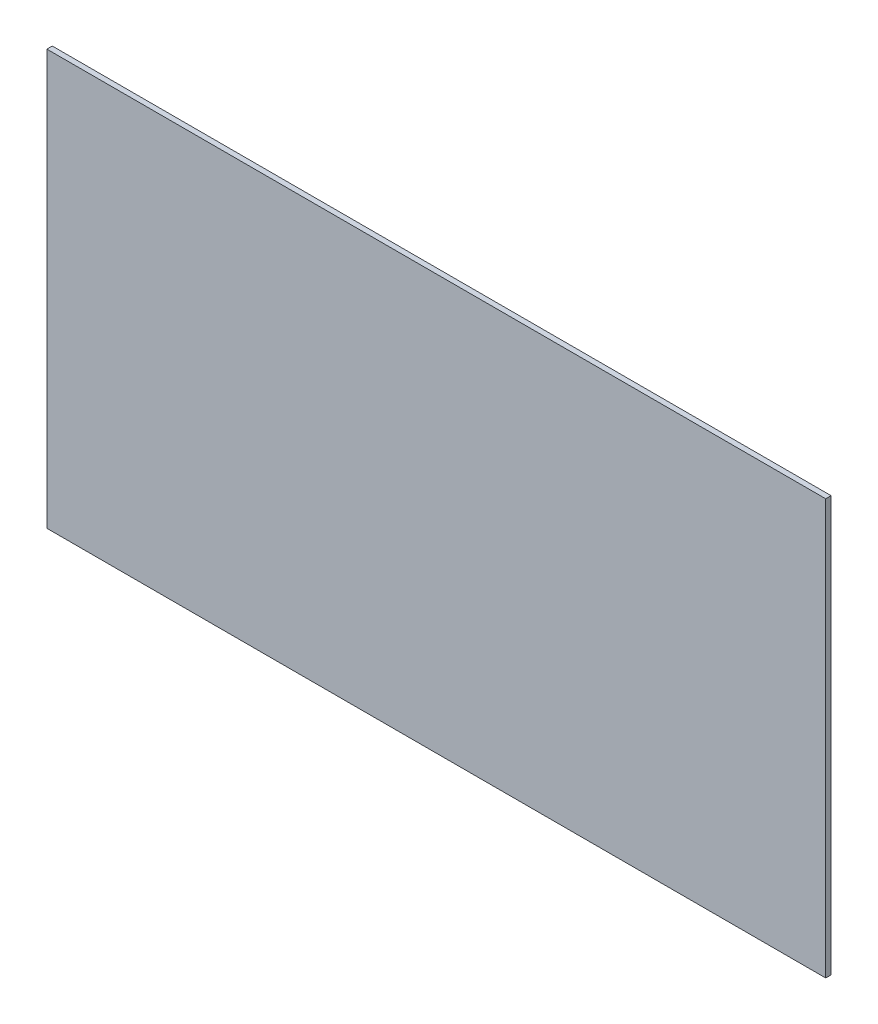
ISO-10303-21;
HEADER;
FILE_DESCRIPTION(('STEP AP214'),'2;1');
FILE_NAME('part.step','',(''),(''),'','','');
FILE_SCHEMA(('AUTOMOTIVE_DESIGN { 1 0 10303 214 1 1 1 1 }'));
ENDSEC;
DATA;
#1=APPLICATION_CONTEXT('core data for automotive mechanical design processes');
#2=APPLICATION_PROTOCOL_DEFINITION('international standard','automotive_design',2000,#1);
#3=PRODUCT_CONTEXT('',#1,'mechanical');
#4=PRODUCT('Part','Part','',(#3));
#5=PRODUCT_RELATED_PRODUCT_CATEGORY('part','',(#4));
#6=PRODUCT_DEFINITION_FORMATION('','',#4);
#7=PRODUCT_DEFINITION_CONTEXT('part definition',#1,'design');
#8=PRODUCT_DEFINITION('design','',#6,#7);
#9=PRODUCT_DEFINITION_SHAPE('','',#8);
#10=(LENGTH_UNIT() NAMED_UNIT(*) SI_UNIT(.MILLI.,.METRE.));
#11=(NAMED_UNIT(*) PLANE_ANGLE_UNIT() SI_UNIT($,.RADIAN.));
#12=(NAMED_UNIT(*) SI_UNIT($,.STERADIAN.) SOLID_ANGLE_UNIT());
#13=UNCERTAINTY_MEASURE_WITH_UNIT(LENGTH_MEASURE(1.E-05),#10,'distance_accuracy_value','');
#14=(GEOMETRIC_REPRESENTATION_CONTEXT(3) GLOBAL_UNCERTAINTY_ASSIGNED_CONTEXT((#13)) GLOBAL_UNIT_ASSIGNED_CONTEXT((#10,
#11,#12)) REPRESENTATION_CONTEXT('',''));
#15=CARTESIAN_POINT('',(0.,0.,0.));
#16=DIRECTION('',(0.,0.,1.));
#17=DIRECTION('',(1.,0.,0.));
#18=AXIS2_PLACEMENT_3D('',#15,#16,#17);
#19=CARTESIAN_POINT('',(0.,0.,12.7));
#20=DIRECTION('',(0.,1.,0.));
#21=DIRECTION('',(0.,0.,1.));
#22=AXIS2_PLACEMENT_3D('',#19,#20,#21);
#23=PLANE('',#22);
#24=DIRECTION('',(1.,0.,0.));
#25=VECTOR('',#24,1.);
#26=CARTESIAN_POINT('',(0.,0.,0.));
#27=LINE('',#26,#25);
#28=CARTESIAN_POINT('',(0.,0.,0.));
#29=VERTEX_POINT('',#28);
#30=CARTESIAN_POINT('',(1835.15,0.,0.));
#31=VERTEX_POINT('',#30);
#32=EDGE_CURVE('E96',#29,#31,#27,.T.);
#33=ORIENTED_EDGE('',*,*,#32,.T.);
#34=DIRECTION('',(0.,0.,-1.));
#35=VECTOR('',#34,1.);
#36=CARTESIAN_POINT('',(1835.15,0.,12.7));
#37=LINE('',#36,#35);
#38=CARTESIAN_POINT('',(1835.15,0.,12.7));
#39=VERTEX_POINT('',#38);
#40=EDGE_CURVE('E11',#39,#31,#37,.T.);
#41=ORIENTED_EDGE('',*,*,#40,.F.);
#42=DIRECTION('',(1.,0.,0.));
#43=VECTOR('',#42,1.);
#44=CARTESIAN_POINT('',(0.,0.,12.7));
#45=LINE('',#44,#43);
#46=CARTESIAN_POINT('',(0.,0.,12.7));
#47=VERTEX_POINT('',#46);
#48=EDGE_CURVE('E82',#47,#39,#45,.T.);
#49=ORIENTED_EDGE('',*,*,#48,.F.);
#50=DIRECTION('',(0.,0.,-1.));
#51=VECTOR('',#50,1.);
#52=CARTESIAN_POINT('',(0.,0.,12.7));
#53=LINE('',#52,#51);
#54=EDGE_CURVE('E49',#47,#29,#53,.T.);
#55=ORIENTED_EDGE('',*,*,#54,.T.);
#56=EDGE_LOOP('',(#33,#41,#49,#55));
#57=FACE_BOUND('',#56,.T.);
#58=ADVANCED_FACE('F33',(#57),#23,.F.);
#59=CARTESIAN_POINT('',(1835.15,0.,12.7));
#60=DIRECTION('',(-1.,0.,0.));
#61=DIRECTION('',(0.,0.,1.));
#62=AXIS2_PLACEMENT_3D('',#59,#60,#61);
#63=PLANE('',#62);
#64=DIRECTION('',(0.,1.,0.));
#65=VECTOR('',#64,1.);
#66=CARTESIAN_POINT('',(1835.15,0.,0.));
#67=LINE('',#66,#65);
#68=CARTESIAN_POINT('',(1835.15,977.9,0.));
#69=VERTEX_POINT('',#68);
#70=EDGE_CURVE('E87',#31,#69,#67,.T.);
#71=ORIENTED_EDGE('',*,*,#70,.T.);
#72=DIRECTION('',(0.,0.,-1.));
#73=VECTOR('',#72,1.);
#74=CARTESIAN_POINT('',(1835.15,977.9,12.7));
#75=LINE('',#74,#73);
#76=CARTESIAN_POINT('',(1835.15,977.9,12.7));
#77=VERTEX_POINT('',#76);
#78=EDGE_CURVE('E41',#77,#69,#75,.T.);
#79=ORIENTED_EDGE('',*,*,#78,.F.);
#80=DIRECTION('',(0.,1.,0.));
#81=VECTOR('',#80,1.);
#82=CARTESIAN_POINT('',(1835.15,0.,12.7));
#83=LINE('',#82,#81);
#84=EDGE_CURVE('E74',#39,#77,#83,.T.);
#85=ORIENTED_EDGE('',*,*,#84,.F.);
#86=ORIENTED_EDGE('',*,*,#40,.T.);
#87=EDGE_LOOP('',(#71,#79,#85,#86));
#88=FACE_BOUND('',#87,.T.);
#89=ADVANCED_FACE('F86',(#88),#63,.F.);
#90=CARTESIAN_POINT('',(0.,977.9,12.7));
#91=DIRECTION('',(0.,1.,0.));
#92=DIRECTION('',(0.,0.,1.));
#93=AXIS2_PLACEMENT_3D('',#90,#91,#92);
#94=PLANE('',#93);
#95=DIRECTION('',(1.,0.,0.));
#96=VECTOR('',#95,1.);
#97=CARTESIAN_POINT('',(0.,977.9,0.));
#98=LINE('',#97,#96);
#99=CARTESIAN_POINT('',(0.,977.9,0.));
#100=VERTEX_POINT('',#99);
#101=EDGE_CURVE('E99',#100,#69,#98,.T.);
#102=ORIENTED_EDGE('',*,*,#101,.F.);
#103=DIRECTION('',(0.,0.,-1.));
#104=VECTOR('',#103,1.);
#105=CARTESIAN_POINT('',(0.,977.9,12.7));
#106=LINE('',#105,#104);
#107=CARTESIAN_POINT('',(0.,977.9,12.7));
#108=VERTEX_POINT('',#107);
#109=EDGE_CURVE('E63',#108,#100,#106,.T.);
#110=ORIENTED_EDGE('',*,*,#109,.F.);
#111=DIRECTION('',(1.,0.,0.));
#112=VECTOR('',#111,1.);
#113=CARTESIAN_POINT('',(0.,977.9,12.7));
#114=LINE('',#113,#112);
#115=EDGE_CURVE('E81',#108,#77,#114,.T.);
#116=ORIENTED_EDGE('',*,*,#115,.T.);
#117=ORIENTED_EDGE('',*,*,#78,.T.);
#118=EDGE_LOOP('',(#102,#110,#116,#117));
#119=FACE_BOUND('',#118,.T.);
#120=ADVANCED_FACE('F90',(#119),#94,.T.);
#121=CARTESIAN_POINT('',(0.,0.,12.7));
#122=DIRECTION('',(-1.,0.,0.));
#123=DIRECTION('',(0.,0.,1.));
#124=AXIS2_PLACEMENT_3D('',#121,#122,#123);
#125=PLANE('',#124);
#126=DIRECTION('',(0.,1.,0.));
#127=VECTOR('',#126,1.);
#128=CARTESIAN_POINT('',(0.,0.,0.));
#129=LINE('',#128,#127);
#130=EDGE_CURVE('E101',#29,#100,#129,.T.);
#131=ORIENTED_EDGE('',*,*,#130,.F.);
#132=ORIENTED_EDGE('',*,*,#54,.F.);
#133=DIRECTION('',(0.,1.,0.));
#134=VECTOR('',#133,1.);
#135=CARTESIAN_POINT('',(0.,0.,12.7));
#136=LINE('',#135,#134);
#137=EDGE_CURVE('E91',#47,#108,#136,.T.);
#138=ORIENTED_EDGE('',*,*,#137,.T.);
#139=ORIENTED_EDGE('',*,*,#109,.T.);
#140=EDGE_LOOP('',(#131,#132,#138,#139));
#141=FACE_BOUND('',#140,.T.);
#142=ADVANCED_FACE('F107',(#141),#125,.T.);
#143=CARTESIAN_POINT('',(0.,0.,12.7));
#144=DIRECTION('',(0.,0.,1.));
#145=DIRECTION('',(1.,0.,0.));
#146=AXIS2_PLACEMENT_3D('',#143,#144,#145);
#147=PLANE('',#146);
#148=ORIENTED_EDGE('',*,*,#48,.T.);
#149=ORIENTED_EDGE('',*,*,#84,.T.);
#150=ORIENTED_EDGE('',*,*,#115,.F.);
#151=ORIENTED_EDGE('',*,*,#137,.F.);
#152=EDGE_LOOP('',(#148,#149,#150,#151));
#153=FACE_BOUND('',#152,.T.);
#154=ADVANCED_FACE('F78',(#153),#147,.T.);
#155=CARTESIAN_POINT('',(0.,0.,0.));
#156=DIRECTION('',(0.,0.,1.));
#157=DIRECTION('',(1.,0.,0.));
#158=AXIS2_PLACEMENT_3D('',#155,#156,#157);
#159=PLANE('',#158);
#160=ORIENTED_EDGE('',*,*,#32,.F.);
#161=ORIENTED_EDGE('',*,*,#130,.T.);
#162=ORIENTED_EDGE('',*,*,#101,.T.);
#163=ORIENTED_EDGE('',*,*,#70,.F.);
#164=EDGE_LOOP('',(#160,#161,#162,#163));
#165=FACE_BOUND('',#164,.T.);
#166=ADVANCED_FACE('F106',(#165),#159,.F.);
#167=CLOSED_SHELL('',(#58,#89,#120,#142,#154,#166));
#168=MANIFOLD_SOLID_BREP('B2',#167);
#169=ADVANCED_BREP_SHAPE_REPRESENTATION('',(#18,#168),#14);
#170=SHAPE_DEFINITION_REPRESENTATION(#9,#169);
ENDSEC;
END-ISO-10303-21;
